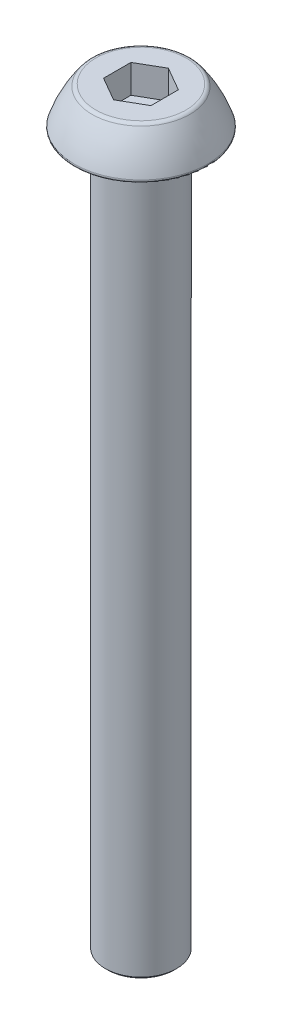
ISO-10303-21;
HEADER;
FILE_DESCRIPTION(('STEP AP214'),'2;1');
FILE_NAME('part.step','',(''),(''),'','','');
FILE_SCHEMA(('AUTOMOTIVE_DESIGN { 1 0 10303 214 1 1 1 1 }'));
ENDSEC;
DATA;
#1=APPLICATION_CONTEXT('core data for automotive mechanical design processes');
#2=APPLICATION_PROTOCOL_DEFINITION('international standard','automotive_design',2000,#1);
#3=PRODUCT_CONTEXT('',#1,'mechanical');
#4=PRODUCT('Part','Part','',(#3));
#5=PRODUCT_RELATED_PRODUCT_CATEGORY('part','',(#4));
#6=PRODUCT_DEFINITION_FORMATION('','',#4);
#7=PRODUCT_DEFINITION_CONTEXT('part definition',#1,'design');
#8=PRODUCT_DEFINITION('design','',#6,#7);
#9=PRODUCT_DEFINITION_SHAPE('','',#8);
#10=(LENGTH_UNIT() NAMED_UNIT(*) SI_UNIT(.MILLI.,.METRE.));
#11=(NAMED_UNIT(*) PLANE_ANGLE_UNIT() SI_UNIT($,.RADIAN.));
#12=(NAMED_UNIT(*) SI_UNIT($,.STERADIAN.) SOLID_ANGLE_UNIT());
#13=UNCERTAINTY_MEASURE_WITH_UNIT(LENGTH_MEASURE(1.E-05),#10,'distance_accuracy_value','');
#14=(GEOMETRIC_REPRESENTATION_CONTEXT(3) GLOBAL_UNCERTAINTY_ASSIGNED_CONTEXT((#13)) GLOBAL_UNIT_ASSIGNED_CONTEXT((#10,
#11,#12)) REPRESENTATION_CONTEXT('',''));
#15=CARTESIAN_POINT('',(0.,0.,0.));
#16=DIRECTION('',(0.,0.,1.));
#17=DIRECTION('',(1.,0.,0.));
#18=AXIS2_PLACEMENT_3D('',#15,#16,#17);
#19=CARTESIAN_POINT('',(0.,0.,0.));
#20=DIRECTION('',(0.,1.,0.));
#21=DIRECTION('',(0.,0.,1.));
#22=AXIS2_PLACEMENT_3D('',#19,#20,#21);
#23=PLANE('',#22);
#24=CARTESIAN_POINT('',(0.,0.,0.));
#25=DIRECTION('',(0.,1.,0.));
#26=DIRECTION('',(0.,0.,1.));
#27=AXIS2_PLACEMENT_3D('',#24,#25,#26);
#28=CIRCLE('',#27,2.71401101775283);
#29=CARTESIAN_POINT('',(0.,0.,2.71401101775283));
#30=VERTEX_POINT('',#29);
#31=EDGE_CURVE('E118',#30,#30,#28,.F.);
#32=ORIENTED_EDGE('',*,*,#31,.T.);
#33=EDGE_LOOP('',(#32));
#34=FACE_BOUND('',#33,.T.);
#35=CARTESIAN_POINT('',(0.,0.,0.));
#36=DIRECTION('',(0.,1.,0.));
#37=DIRECTION('',(0.,0.,1.));
#38=AXIS2_PLACEMENT_3D('',#35,#36,#37);
#39=CIRCLE('',#38,1.5);
#40=CARTESIAN_POINT('',(0.,0.,1.5));
#41=VERTEX_POINT('',#40);
#42=EDGE_CURVE('E137',#41,#41,#39,.F.);
#43=ORIENTED_EDGE('',*,*,#42,.F.);
#44=EDGE_LOOP('',(#43));
#45=FACE_BOUND('',#44,.T.);
#46=ADVANCED_FACE('F17',(#34,#45),#23,.F.);
#47=CARTESIAN_POINT('',(-2.,1.65,0.));
#48=DIRECTION('',(0.,-1.,0.));
#49=DIRECTION('',(0.,0.,-1.));
#50=AXIS2_PLACEMENT_3D('',#47,#48,#49);
#51=PLANE('',#50);
#52=DIRECTION('',(-0.866025403784439,0.,0.5));
#53=VECTOR('',#52,1.);
#54=CARTESIAN_POINT('',(0.,1.65,-1.15470053837925));
#55=LINE('',#54,#53);
#56=CARTESIAN_POINT('',(0.,1.65,-1.15470053837925));
#57=VERTEX_POINT('',#56);
#58=CARTESIAN_POINT('',(-1.,1.65,-0.577350269189626));
#59=VERTEX_POINT('',#58);
#60=EDGE_CURVE('E106',#57,#59,#55,.T.);
#61=ORIENTED_EDGE('',*,*,#60,.F.);
#62=DIRECTION('',(-0.866025403784439,0.,-0.5));
#63=VECTOR('',#62,1.);
#64=CARTESIAN_POINT('',(1.,1.65,-0.577350269189626));
#65=LINE('',#64,#63);
#66=CARTESIAN_POINT('',(1.,1.65,-0.577350269189626));
#67=VERTEX_POINT('',#66);
#68=EDGE_CURVE('E32',#67,#57,#65,.T.);
#69=ORIENTED_EDGE('',*,*,#68,.F.);
#70=DIRECTION('',(0.,0.,-1.));
#71=VECTOR('',#70,1.);
#72=CARTESIAN_POINT('',(1.,1.65,0.577350269189626));
#73=LINE('',#72,#71);
#74=CARTESIAN_POINT('',(1.,1.65,0.577350269189626));
#75=VERTEX_POINT('',#74);
#76=EDGE_CURVE('E113',#75,#67,#73,.T.);
#77=ORIENTED_EDGE('',*,*,#76,.F.);
#78=DIRECTION('',(0.866025403784439,0.,-0.5));
#79=VECTOR('',#78,1.);
#80=CARTESIAN_POINT('',(0.,1.65,1.15470053837925));
#81=LINE('',#80,#79);
#82=CARTESIAN_POINT('',(0.,1.65,1.15470053837925));
#83=VERTEX_POINT('',#82);
#84=EDGE_CURVE('E114',#83,#75,#81,.T.);
#85=ORIENTED_EDGE('',*,*,#84,.F.);
#86=DIRECTION('',(0.866025403784439,0.,0.5));
#87=VECTOR('',#86,1.);
#88=CARTESIAN_POINT('',(-1.,1.65,0.577350269189626));
#89=LINE('',#88,#87);
#90=CARTESIAN_POINT('',(-1.,1.65,0.577350269189626));
#91=VERTEX_POINT('',#90);
#92=EDGE_CURVE('E79',#91,#83,#89,.T.);
#93=ORIENTED_EDGE('',*,*,#92,.F.);
#94=DIRECTION('',(0.,0.,1.));
#95=VECTOR('',#94,1.);
#96=CARTESIAN_POINT('',(-1.,1.65,-0.577350269189626));
#97=LINE('',#96,#95);
#98=EDGE_CURVE('E108',#59,#91,#97,.T.);
#99=ORIENTED_EDGE('',*,*,#98,.F.);
#100=EDGE_LOOP('',(#61,#69,#77,#85,#93,#99));
#101=FACE_BOUND('',#100,.T.);
#102=CARTESIAN_POINT('',(0.,1.65,0.));
#103=DIRECTION('',(0.,-1.,0.));
#104=DIRECTION('',(0.,0.,-1.));
#105=AXIS2_PLACEMENT_3D('',#102,#103,#104);
#106=CIRCLE('',#105,1.90110924353599);
#107=CARTESIAN_POINT('',(0.,1.65,-1.90110924353599));
#108=VERTEX_POINT('',#107);
#109=EDGE_CURVE('E132',#108,#108,#106,.F.);
#110=ORIENTED_EDGE('',*,*,#109,.T.);
#111=EDGE_LOOP('',(#110));
#112=FACE_BOUND('',#111,.T.);
#113=ADVANCED_FACE('F152',(#101,#112),#51,.F.);
#114=CARTESIAN_POINT('',(0.,-1.42499576680782,0.));
#115=DIRECTION('',(0.,-1.,0.));
#116=DIRECTION('',(0.,0.,-1.));
#117=AXIS2_PLACEMENT_3D('',#114,#115,#116);
#118=DEGENERATE_TOROIDAL_SURFACE('',#117,1.94263884145048,5.,.F.);
#119=CARTESIAN_POINT('',(0.,1.56979149028366,0.));
#120=DIRECTION('',(0.,-1.,0.));
#121=DIRECTION('',(0.,0.,-1.));
#122=AXIS2_PLACEMENT_3D('',#119,#120,#121);
#123=CIRCLE('',#122,2.06126541374375);
#124=CARTESIAN_POINT('',(0.,1.56979149028366,-2.06126541374375));
#125=VERTEX_POINT('',#124);
#126=EDGE_CURVE('E129',#125,#125,#123,.T.);
#127=ORIENTED_EDGE('',*,*,#126,.T.);
#128=EDGE_LOOP('',(#127));
#129=FACE_BOUND('',#128,.T.);
#130=CARTESIAN_POINT('',(0.,0.131122362587915,0.));
#131=DIRECTION('',(0.,-1.,0.));
#132=DIRECTION('',(0.,0.,-1.));
#133=AXIS2_PLACEMENT_3D('',#130,#131,#132);
#134=CIRCLE('',#133,2.80904468834882);
#135=CARTESIAN_POINT('',(0.,0.131122362587915,-2.80904468834882));
#136=VERTEX_POINT('',#135);
#137=EDGE_CURVE('E126',#136,#136,#134,.F.);
#138=ORIENTED_EDGE('',*,*,#137,.T.);
#139=EDGE_LOOP('',(#138));
#140=FACE_BOUND('',#139,.T.);
#141=ADVANCED_FACE('F161',(#129,#140),#118,.F.);
#142=CARTESIAN_POINT('',(0.,0.1,0.));
#143=DIRECTION('',(0.,1.,0.));
#144=DIRECTION('',(0.,0.,1.));
#145=AXIS2_PLACEMENT_3D('',#142,#143,#144);
#146=TOROIDAL_SURFACE('',#145,2.71401101775283,0.1);
#147=ORIENTED_EDGE('',*,*,#137,.F.);
#148=EDGE_LOOP('',(#147));
#149=FACE_BOUND('',#148,.T.);
#150=ORIENTED_EDGE('',*,*,#31,.F.);
#151=EDGE_LOOP('',(#150));
#152=FACE_BOUND('',#151,.T.);
#153=ADVANCED_FACE('F168',(#149,#152),#146,.T.);
#154=CARTESIAN_POINT('',(0.,1.45,0.));
#155=DIRECTION('',(0.,-1.,0.));
#156=DIRECTION('',(0.,0.,-1.));
#157=AXIS2_PLACEMENT_3D('',#154,#155,#156);
#158=TOROIDAL_SURFACE('',#157,1.90110924353599,0.2);
#159=ORIENTED_EDGE('',*,*,#109,.F.);
#160=EDGE_LOOP('',(#159));
#161=FACE_BOUND('',#160,.T.);
#162=ORIENTED_EDGE('',*,*,#126,.F.);
#163=EDGE_LOOP('',(#162));
#164=FACE_BOUND('',#163,.T.);
#165=ADVANCED_FACE('F173',(#161,#164),#158,.T.);
#166=CARTESIAN_POINT('',(1.,0.45,-0.577350269189626));
#167=DIRECTION('',(0.5,0.,-0.866025403784439));
#168=DIRECTION('',(-0.866025403784439,0.,-0.5));
#169=AXIS2_PLACEMENT_3D('',#166,#167,#168);
#170=PLANE('',#169);
#171=ORIENTED_EDGE('',*,*,#68,.T.);
#172=DIRECTION('',(0.,1.,0.));
#173=VECTOR('',#172,1.);
#174=CARTESIAN_POINT('',(0.,0.45,-1.15470053837925));
#175=LINE('',#174,#173);
#176=CARTESIAN_POINT('',(0.,0.45,-1.15470053837925));
#177=VERTEX_POINT('',#176);
#178=EDGE_CURVE('E62',#177,#57,#175,.T.);
#179=ORIENTED_EDGE('',*,*,#178,.F.);
#180=DIRECTION('',(-0.866025403784439,0.,-0.5));
#181=VECTOR('',#180,1.);
#182=CARTESIAN_POINT('',(1.,0.45,-0.577350269189626));
#183=LINE('',#182,#181);
#184=CARTESIAN_POINT('',(1.,0.45,-0.577350269189626));
#185=VERTEX_POINT('',#184);
#186=EDGE_CURVE('E117',#185,#177,#183,.T.);
#187=ORIENTED_EDGE('',*,*,#186,.F.);
#188=DIRECTION('',(0.,1.,0.));
#189=VECTOR('',#188,1.);
#190=CARTESIAN_POINT('',(1.,0.45,-0.577350269189626));
#191=LINE('',#190,#189);
#192=EDGE_CURVE('E37',#185,#67,#191,.T.);
#193=ORIENTED_EDGE('',*,*,#192,.T.);
#194=EDGE_LOOP('',(#171,#179,#187,#193));
#195=FACE_BOUND('',#194,.T.);
#196=ADVANCED_FACE('F170',(#195),#170,.F.);
#197=CARTESIAN_POINT('',(1.,0.45,0.577350269189626));
#198=DIRECTION('',(1.,0.,0.));
#199=DIRECTION('',(0.,0.,-1.));
#200=AXIS2_PLACEMENT_3D('',#197,#198,#199);
#201=PLANE('',#200);
#202=ORIENTED_EDGE('',*,*,#76,.T.);
#203=ORIENTED_EDGE('',*,*,#192,.F.);
#204=DIRECTION('',(0.,0.,-1.));
#205=VECTOR('',#204,1.);
#206=CARTESIAN_POINT('',(1.,0.45,0.577350269189626));
#207=LINE('',#206,#205);
#208=CARTESIAN_POINT('',(1.,0.45,0.577350269189626));
#209=VERTEX_POINT('',#208);
#210=EDGE_CURVE('E95',#209,#185,#207,.T.);
#211=ORIENTED_EDGE('',*,*,#210,.F.);
#212=DIRECTION('',(0.,1.,0.));
#213=VECTOR('',#212,1.);
#214=CARTESIAN_POINT('',(1.,0.45,0.577350269189626));
#215=LINE('',#214,#213);
#216=EDGE_CURVE('E81',#209,#75,#215,.T.);
#217=ORIENTED_EDGE('',*,*,#216,.T.);
#218=EDGE_LOOP('',(#202,#203,#211,#217));
#219=FACE_BOUND('',#218,.T.);
#220=ADVANCED_FACE('F181',(#219),#201,.F.);
#221=CARTESIAN_POINT('',(0.,0.45,1.15470053837925));
#222=DIRECTION('',(0.5,0.,0.866025403784439));
#223=DIRECTION('',(0.866025403784439,0.,-0.5));
#224=AXIS2_PLACEMENT_3D('',#221,#222,#223);
#225=PLANE('',#224);
#226=ORIENTED_EDGE('',*,*,#84,.T.);
#227=ORIENTED_EDGE('',*,*,#216,.F.);
#228=DIRECTION('',(0.866025403784439,0.,-0.5));
#229=VECTOR('',#228,1.);
#230=CARTESIAN_POINT('',(0.,0.45,1.15470053837925));
#231=LINE('',#230,#229);
#232=CARTESIAN_POINT('',(0.,0.45,1.15470053837925));
#233=VERTEX_POINT('',#232);
#234=EDGE_CURVE('E86',#233,#209,#231,.T.);
#235=ORIENTED_EDGE('',*,*,#234,.F.);
#236=DIRECTION('',(0.,1.,0.));
#237=VECTOR('',#236,1.);
#238=CARTESIAN_POINT('',(0.,0.45,1.15470053837925));
#239=LINE('',#238,#237);
#240=EDGE_CURVE('E73',#233,#83,#239,.T.);
#241=ORIENTED_EDGE('',*,*,#240,.T.);
#242=EDGE_LOOP('',(#226,#227,#235,#241));
#243=FACE_BOUND('',#242,.T.);
#244=ADVANCED_FACE('F90',(#243),#225,.F.);
#245=CARTESIAN_POINT('',(-1.,0.45,0.577350269189626));
#246=DIRECTION('',(-0.5,0.,0.866025403784439));
#247=DIRECTION('',(0.866025403784439,0.,0.5));
#248=AXIS2_PLACEMENT_3D('',#245,#246,#247);
#249=PLANE('',#248);
#250=ORIENTED_EDGE('',*,*,#92,.T.);
#251=ORIENTED_EDGE('',*,*,#240,.F.);
#252=DIRECTION('',(0.866025403784439,0.,0.5));
#253=VECTOR('',#252,1.);
#254=CARTESIAN_POINT('',(-1.,0.45,0.577350269189626));
#255=LINE('',#254,#253);
#256=CARTESIAN_POINT('',(-1.,0.45,0.577350269189626));
#257=VERTEX_POINT('',#256);
#258=EDGE_CURVE('E80',#257,#233,#255,.T.);
#259=ORIENTED_EDGE('',*,*,#258,.F.);
#260=DIRECTION('',(0.,1.,0.));
#261=VECTOR('',#260,1.);
#262=CARTESIAN_POINT('',(-1.,0.45,0.577350269189626));
#263=LINE('',#262,#261);
#264=EDGE_CURVE('E83',#257,#91,#263,.T.);
#265=ORIENTED_EDGE('',*,*,#264,.T.);
#266=EDGE_LOOP('',(#250,#251,#259,#265));
#267=FACE_BOUND('',#266,.T.);
#268=ADVANCED_FACE('F74',(#267),#249,.F.);
#269=CARTESIAN_POINT('',(-1.,0.45,-0.577350269189626));
#270=DIRECTION('',(-1.,0.,0.));
#271=DIRECTION('',(0.,0.,1.));
#272=AXIS2_PLACEMENT_3D('',#269,#270,#271);
#273=PLANE('',#272);
#274=ORIENTED_EDGE('',*,*,#98,.T.);
#275=ORIENTED_EDGE('',*,*,#264,.F.);
#276=DIRECTION('',(0.,0.,1.));
#277=VECTOR('',#276,1.);
#278=CARTESIAN_POINT('',(-1.,0.45,-0.577350269189626));
#279=LINE('',#278,#277);
#280=CARTESIAN_POINT('',(-1.,0.45,-0.577350269189626));
#281=VERTEX_POINT('',#280);
#282=EDGE_CURVE('E98',#281,#257,#279,.T.);
#283=ORIENTED_EDGE('',*,*,#282,.F.);
#284=DIRECTION('',(0.,1.,0.));
#285=VECTOR('',#284,1.);
#286=CARTESIAN_POINT('',(-1.,0.45,-0.577350269189626));
#287=LINE('',#286,#285);
#288=EDGE_CURVE('E121',#281,#59,#287,.T.);
#289=ORIENTED_EDGE('',*,*,#288,.T.);
#290=EDGE_LOOP('',(#274,#275,#283,#289));
#291=FACE_BOUND('',#290,.T.);
#292=ADVANCED_FACE('F206',(#291),#273,.F.);
#293=CARTESIAN_POINT('',(0.,0.45,-1.15470053837925));
#294=DIRECTION('',(-0.5,0.,-0.866025403784439));
#295=DIRECTION('',(-0.866025403784439,0.,0.5));
#296=AXIS2_PLACEMENT_3D('',#293,#294,#295);
#297=PLANE('',#296);
#298=ORIENTED_EDGE('',*,*,#60,.T.);
#299=ORIENTED_EDGE('',*,*,#288,.F.);
#300=DIRECTION('',(-0.866025403784439,0.,0.5));
#301=VECTOR('',#300,1.);
#302=CARTESIAN_POINT('',(0.,0.45,-1.15470053837925));
#303=LINE('',#302,#301);
#304=EDGE_CURVE('E99',#177,#281,#303,.T.);
#305=ORIENTED_EDGE('',*,*,#304,.F.);
#306=ORIENTED_EDGE('',*,*,#178,.T.);
#307=EDGE_LOOP('',(#298,#299,#305,#306));
#308=FACE_BOUND('',#307,.T.);
#309=ADVANCED_FACE('F208',(#308),#297,.F.);
#310=CARTESIAN_POINT('',(0.,0.45,0.));
#311=DIRECTION('',(0.,1.,0.));
#312=DIRECTION('',(0.,0.,1.));
#313=AXIS2_PLACEMENT_3D('',#310,#311,#312);
#314=PLANE('',#313);
#315=ORIENTED_EDGE('',*,*,#186,.T.);
#316=ORIENTED_EDGE('',*,*,#304,.T.);
#317=ORIENTED_EDGE('',*,*,#282,.T.);
#318=ORIENTED_EDGE('',*,*,#258,.T.);
#319=ORIENTED_EDGE('',*,*,#234,.T.);
#320=ORIENTED_EDGE('',*,*,#210,.T.);
#321=EDGE_LOOP('',(#315,#316,#317,#318,#319,#320));
#322=FACE_BOUND('',#321,.T.);
#323=ADVANCED_FACE('F92',(#322),#314,.T.);
#324=CARTESIAN_POINT('',(0.,-30.,0.));
#325=DIRECTION('',(0.,1.,0.));
#326=DIRECTION('',(0.,0.,1.));
#327=AXIS2_PLACEMENT_3D('',#324,#325,#326);
#328=CYLINDRICAL_SURFACE('',#327,1.5);
#329=CARTESIAN_POINT('',(0.,-29.9,0.));
#330=DIRECTION('',(0.,-1.,0.));
#331=DIRECTION('',(0.,0.,-1.));
#332=AXIS2_PLACEMENT_3D('',#329,#330,#331);
#333=CIRCLE('',#332,1.5);
#334=CARTESIAN_POINT('',(0.,-29.9,-1.5));
#335=VERTEX_POINT('',#334);
#336=EDGE_CURVE('E11',#335,#335,#333,.F.);
#337=ORIENTED_EDGE('',*,*,#336,.T.);
#338=EDGE_LOOP('',(#337));
#339=FACE_BOUND('',#338,.T.);
#340=ORIENTED_EDGE('',*,*,#42,.T.);
#341=EDGE_LOOP('',(#340));
#342=FACE_BOUND('',#341,.T.);
#343=ADVANCED_FACE('F147',(#339,#342),#328,.T.);
#344=CARTESIAN_POINT('',(0.,-30.,0.));
#345=DIRECTION('',(0.,-1.,0.));
#346=DIRECTION('',(0.,0.,-1.));
#347=AXIS2_PLACEMENT_3D('',#344,#345,#346);
#348=PLANE('',#347);
#349=CARTESIAN_POINT('',(0.,-30.,0.));
#350=DIRECTION('',(0.,-1.,0.));
#351=DIRECTION('',(0.,0.,-1.));
#352=AXIS2_PLACEMENT_3D('',#349,#350,#351);
#353=CIRCLE('',#352,1.40000000000001);
#354=CARTESIAN_POINT('',(0.,-30.,-1.40000000000001));
#355=VERTEX_POINT('',#354);
#356=EDGE_CURVE('E25',#355,#355,#353,.T.);
#357=ORIENTED_EDGE('',*,*,#356,.T.);
#358=EDGE_LOOP('',(#357));
#359=FACE_BOUND('',#358,.T.);
#360=ADVANCED_FACE('F143',(#359),#348,.T.);
#361=CARTESIAN_POINT('',(0.,-30.,0.));
#362=DIRECTION('',(0.,1.,0.));
#363=DIRECTION('',(0.,0.,1.));
#364=AXIS2_PLACEMENT_3D('',#361,#362,#363);
#365=CONICAL_SURFACE('',#364,1.40000000000001,0.785398163397443);
#366=ORIENTED_EDGE('',*,*,#336,.F.);
#367=EDGE_LOOP('',(#366));
#368=FACE_BOUND('',#367,.T.);
#369=ORIENTED_EDGE('',*,*,#356,.F.);
#370=EDGE_LOOP('',(#369));
#371=FACE_BOUND('',#370,.T.);
#372=ADVANCED_FACE('F19',(#368,#371),#365,.T.);
#373=CLOSED_SHELL('',(#46,#113,#141,#153,#165,#196,#220,#244,#268,#292,#309,#323,#343,#360,#372));
#374=MANIFOLD_SOLID_BREP('B1',#373);
#375=ADVANCED_BREP_SHAPE_REPRESENTATION('',(#18,#374),#14);
#376=SHAPE_DEFINITION_REPRESENTATION(#9,#375);
ENDSEC;
END-ISO-10303-21;
